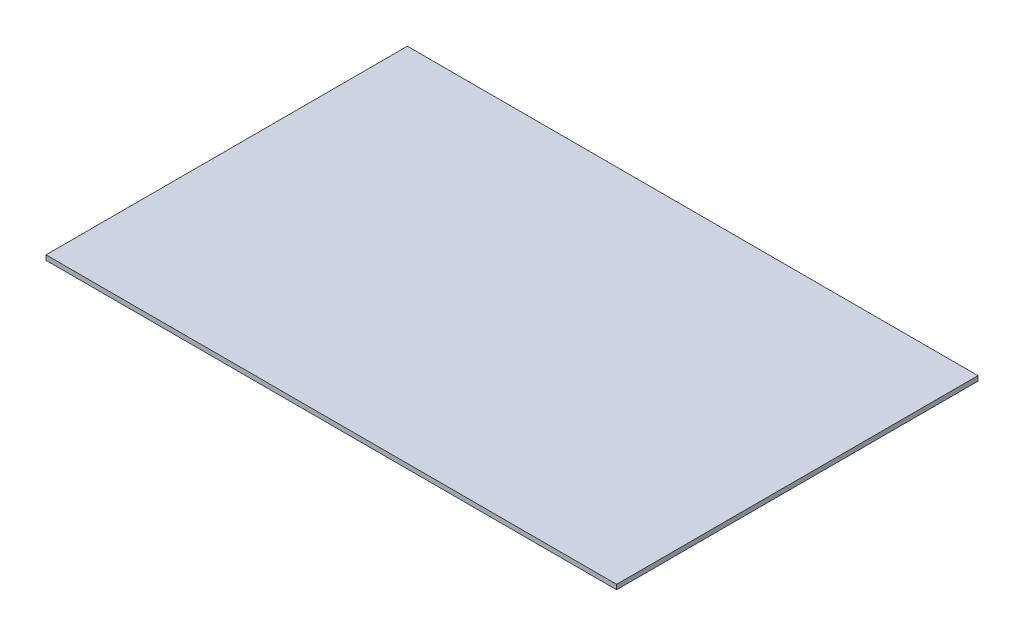
ISO-10303-21;
HEADER;
FILE_DESCRIPTION(('STEP AP214'),'2;1');
FILE_NAME('part.step','',(''),(''),'','','');
FILE_SCHEMA(('AUTOMOTIVE_DESIGN { 1 0 10303 214 1 1 1 1 }'));
ENDSEC;
DATA;
#1=APPLICATION_CONTEXT('core data for automotive mechanical design processes');
#2=APPLICATION_PROTOCOL_DEFINITION('international standard','automotive_design',2000,#1);
#3=PRODUCT_CONTEXT('',#1,'mechanical');
#4=PRODUCT('Part','Part','',(#3));
#5=PRODUCT_RELATED_PRODUCT_CATEGORY('part','',(#4));
#6=PRODUCT_DEFINITION_FORMATION('','',#4);
#7=PRODUCT_DEFINITION_CONTEXT('part definition',#1,'design');
#8=PRODUCT_DEFINITION('design','',#6,#7);
#9=PRODUCT_DEFINITION_SHAPE('','',#8);
#10=(LENGTH_UNIT() NAMED_UNIT(*) SI_UNIT(.MILLI.,.METRE.));
#11=(NAMED_UNIT(*) PLANE_ANGLE_UNIT() SI_UNIT($,.RADIAN.));
#12=(NAMED_UNIT(*) SI_UNIT($,.STERADIAN.) SOLID_ANGLE_UNIT());
#13=UNCERTAINTY_MEASURE_WITH_UNIT(LENGTH_MEASURE(1.E-05),#10,'distance_accuracy_value','');
#14=(GEOMETRIC_REPRESENTATION_CONTEXT(3) GLOBAL_UNCERTAINTY_ASSIGNED_CONTEXT((#13)) GLOBAL_UNIT_ASSIGNED_CONTEXT((#10,
#11,#12)) REPRESENTATION_CONTEXT('',''));
#15=CARTESIAN_POINT('',(0.,0.,0.));
#16=DIRECTION('',(0.,0.,1.));
#17=DIRECTION('',(1.,0.,0.));
#18=AXIS2_PLACEMENT_3D('',#15,#16,#17);
#19=CARTESIAN_POINT('',(120.,2.,-76.));
#20=DIRECTION('',(-1.,0.,0.));
#21=DIRECTION('',(0.,0.,1.));
#22=AXIS2_PLACEMENT_3D('',#19,#20,#21);
#23=PLANE('',#22);
#24=DIRECTION('',(0.,0.,-1.));
#25=VECTOR('',#24,1.);
#26=CARTESIAN_POINT('',(120.,0.,-76.));
#27=LINE('',#26,#25);
#28=CARTESIAN_POINT('',(120.,0.,76.));
#29=VERTEX_POINT('',#28);
#30=CARTESIAN_POINT('',(120.,0.,-76.));
#31=VERTEX_POINT('',#30);
#32=EDGE_CURVE('E111',#29,#31,#27,.T.);
#33=ORIENTED_EDGE('',*,*,#32,.T.);
#34=DIRECTION('',(0.,-1.,0.));
#35=VECTOR('',#34,1.);
#36=CARTESIAN_POINT('',(120.,2.,-76.));
#37=LINE('',#36,#35);
#38=CARTESIAN_POINT('',(120.,2.,-76.));
#39=VERTEX_POINT('',#38);
#40=EDGE_CURVE('E11',#39,#31,#37,.T.);
#41=ORIENTED_EDGE('',*,*,#40,.F.);
#42=DIRECTION('',(0.,0.,-1.));
#43=VECTOR('',#42,1.);
#44=CARTESIAN_POINT('',(120.,2.,-76.));
#45=LINE('',#44,#43);
#46=CARTESIAN_POINT('',(120.,2.,76.));
#47=VERTEX_POINT('',#46);
#48=EDGE_CURVE('E95',#47,#39,#45,.T.);
#49=ORIENTED_EDGE('',*,*,#48,.F.);
#50=DIRECTION('',(0.,-1.,0.));
#51=VECTOR('',#50,1.);
#52=CARTESIAN_POINT('',(120.,2.,76.));
#53=LINE('',#52,#51);
#54=EDGE_CURVE('E107',#47,#29,#53,.T.);
#55=ORIENTED_EDGE('',*,*,#54,.T.);
#56=EDGE_LOOP('',(#33,#41,#49,#55));
#57=FACE_BOUND('',#56,.T.);
#58=ADVANCED_FACE('F43',(#57),#23,.F.);
#59=CARTESIAN_POINT('',(-120.,2.,-76.));
#60=DIRECTION('',(0.,0.,1.));
#61=DIRECTION('',(1.,0.,0.));
#62=AXIS2_PLACEMENT_3D('',#59,#60,#61);
#63=PLANE('',#62);
#64=DIRECTION('',(-1.,0.,0.));
#65=VECTOR('',#64,1.);
#66=CARTESIAN_POINT('',(-120.,0.,-76.));
#67=LINE('',#66,#65);
#68=CARTESIAN_POINT('',(-120.,0.,-76.));
#69=VERTEX_POINT('',#68);
#70=EDGE_CURVE('E100',#31,#69,#67,.T.);
#71=ORIENTED_EDGE('',*,*,#70,.T.);
#72=DIRECTION('',(0.,-1.,0.));
#73=VECTOR('',#72,1.);
#74=CARTESIAN_POINT('',(-120.,2.,-76.));
#75=LINE('',#74,#73);
#76=CARTESIAN_POINT('',(-120.,2.,-76.));
#77=VERTEX_POINT('',#76);
#78=EDGE_CURVE('E52',#77,#69,#75,.T.);
#79=ORIENTED_EDGE('',*,*,#78,.F.);
#80=DIRECTION('',(-1.,0.,0.));
#81=VECTOR('',#80,1.);
#82=CARTESIAN_POINT('',(-120.,2.,-76.));
#83=LINE('',#82,#81);
#84=EDGE_CURVE('E90',#39,#77,#83,.T.);
#85=ORIENTED_EDGE('',*,*,#84,.F.);
#86=ORIENTED_EDGE('',*,*,#40,.T.);
#87=EDGE_LOOP('',(#71,#79,#85,#86));
#88=FACE_BOUND('',#87,.T.);
#89=ADVANCED_FACE('F99',(#88),#63,.F.);
#90=CARTESIAN_POINT('',(-120.,2.,-76.));
#91=DIRECTION('',(1.,0.,0.));
#92=DIRECTION('',(0.,0.,-1.));
#93=AXIS2_PLACEMENT_3D('',#90,#91,#92);
#94=PLANE('',#93);
#95=DIRECTION('',(0.,0.,1.));
#96=VECTOR('',#95,1.);
#97=CARTESIAN_POINT('',(-120.,0.,-76.));
#98=LINE('',#97,#96);
#99=CARTESIAN_POINT('',(-120.,0.,76.));
#100=VERTEX_POINT('',#99);
#101=EDGE_CURVE('E77',#69,#100,#98,.T.);
#102=ORIENTED_EDGE('',*,*,#101,.T.);
#103=DIRECTION('',(0.,-1.,0.));
#104=VECTOR('',#103,1.);
#105=CARTESIAN_POINT('',(-120.,2.,76.));
#106=LINE('',#105,#104);
#107=CARTESIAN_POINT('',(-120.,2.,76.));
#108=VERTEX_POINT('',#107);
#109=EDGE_CURVE('E102',#108,#100,#106,.T.);
#110=ORIENTED_EDGE('',*,*,#109,.F.);
#111=DIRECTION('',(0.,0.,1.));
#112=VECTOR('',#111,1.);
#113=CARTESIAN_POINT('',(-120.,2.,-76.));
#114=LINE('',#113,#112);
#115=EDGE_CURVE('E93',#77,#108,#114,.T.);
#116=ORIENTED_EDGE('',*,*,#115,.F.);
#117=ORIENTED_EDGE('',*,*,#78,.T.);
#118=EDGE_LOOP('',(#102,#110,#116,#117));
#119=FACE_BOUND('',#118,.T.);
#120=ADVANCED_FACE('F103',(#119),#94,.F.);
#121=CARTESIAN_POINT('',(-120.,2.,76.));
#122=DIRECTION('',(0.,0.,-1.));
#123=DIRECTION('',(-1.,0.,0.));
#124=AXIS2_PLACEMENT_3D('',#121,#122,#123);
#125=PLANE('',#124);
#126=DIRECTION('',(1.,0.,0.));
#127=VECTOR('',#126,1.);
#128=CARTESIAN_POINT('',(-120.,0.,76.));
#129=LINE('',#128,#127);
#130=EDGE_CURVE('E83',#100,#29,#129,.T.);
#131=ORIENTED_EDGE('',*,*,#130,.T.);
#132=ORIENTED_EDGE('',*,*,#54,.F.);
#133=DIRECTION('',(1.,0.,0.));
#134=VECTOR('',#133,1.);
#135=CARTESIAN_POINT('',(-120.,2.,76.));
#136=LINE('',#135,#134);
#137=EDGE_CURVE('E60',#108,#47,#136,.T.);
#138=ORIENTED_EDGE('',*,*,#137,.F.);
#139=ORIENTED_EDGE('',*,*,#109,.T.);
#140=EDGE_LOOP('',(#131,#132,#138,#139));
#141=FACE_BOUND('',#140,.T.);
#142=ADVANCED_FACE('F124',(#141),#125,.F.);
#143=CARTESIAN_POINT('',(0.,2.,0.));
#144=DIRECTION('',(0.,1.,0.));
#145=DIRECTION('',(0.,0.,1.));
#146=AXIS2_PLACEMENT_3D('',#143,#144,#145);
#147=PLANE('',#146);
#148=ORIENTED_EDGE('',*,*,#48,.T.);
#149=ORIENTED_EDGE('',*,*,#84,.T.);
#150=ORIENTED_EDGE('',*,*,#115,.T.);
#151=ORIENTED_EDGE('',*,*,#137,.T.);
#152=EDGE_LOOP('',(#148,#149,#150,#151));
#153=FACE_BOUND('',#152,.T.);
#154=ADVANCED_FACE('F91',(#153),#147,.T.);
#155=CARTESIAN_POINT('',(0.,0.,0.));
#156=DIRECTION('',(0.,1.,0.));
#157=DIRECTION('',(0.,0.,1.));
#158=AXIS2_PLACEMENT_3D('',#155,#156,#157);
#159=PLANE('',#158);
#160=ORIENTED_EDGE('',*,*,#32,.F.);
#161=ORIENTED_EDGE('',*,*,#130,.F.);
#162=ORIENTED_EDGE('',*,*,#101,.F.);
#163=ORIENTED_EDGE('',*,*,#70,.F.);
#164=EDGE_LOOP('',(#160,#161,#162,#163));
#165=FACE_BOUND('',#164,.T.);
#166=ADVANCED_FACE('F127',(#165),#159,.F.);
#167=CLOSED_SHELL('',(#58,#89,#120,#142,#154,#166));
#168=MANIFOLD_SOLID_BREP('B2',#167);
#169=ADVANCED_BREP_SHAPE_REPRESENTATION('',(#18,#168),#14);
#170=SHAPE_DEFINITION_REPRESENTATION(#9,#169);
ENDSEC;
END-ISO-10303-21;
